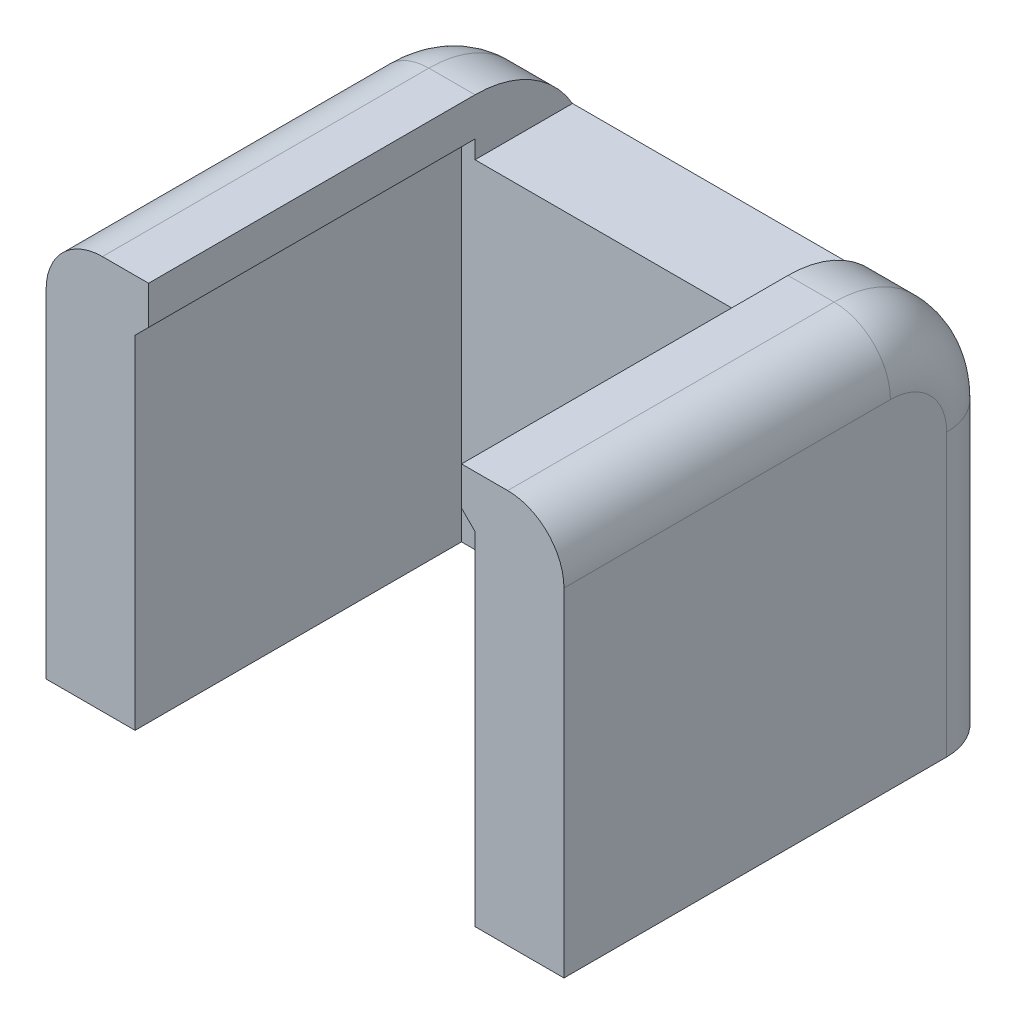
ISO-10303-21;
HEADER;
FILE_DESCRIPTION(('STEP AP214'),'2;1');
FILE_NAME('part.step','',(''),(''),'','','');
FILE_SCHEMA(('AUTOMOTIVE_DESIGN { 1 0 10303 214 1 1 1 1 }'));
ENDSEC;
DATA;
#1=APPLICATION_CONTEXT('core data for automotive mechanical design processes');
#2=APPLICATION_PROTOCOL_DEFINITION('international standard','automotive_design',2000,#1);
#3=PRODUCT_CONTEXT('',#1,'mechanical');
#4=PRODUCT('Part','Part','',(#3));
#5=PRODUCT_RELATED_PRODUCT_CATEGORY('part','',(#4));
#6=PRODUCT_DEFINITION_FORMATION('','',#4);
#7=PRODUCT_DEFINITION_CONTEXT('part definition',#1,'design');
#8=PRODUCT_DEFINITION('design','',#6,#7);
#9=PRODUCT_DEFINITION_SHAPE('','',#8);
#10=(LENGTH_UNIT() NAMED_UNIT(*) SI_UNIT(.MILLI.,.METRE.));
#11=(NAMED_UNIT(*) PLANE_ANGLE_UNIT() SI_UNIT($,.RADIAN.));
#12=(NAMED_UNIT(*) SI_UNIT($,.STERADIAN.) SOLID_ANGLE_UNIT());
#13=UNCERTAINTY_MEASURE_WITH_UNIT(LENGTH_MEASURE(1.E-05),#10,'distance_accuracy_value','');
#14=(GEOMETRIC_REPRESENTATION_CONTEXT(3) GLOBAL_UNCERTAINTY_ASSIGNED_CONTEXT((#13)) GLOBAL_UNIT_ASSIGNED_CONTEXT((#10,
#11,#12)) REPRESENTATION_CONTEXT('',''));
#15=CARTESIAN_POINT('',(0.,0.,0.));
#16=DIRECTION('',(0.,0.,1.));
#17=DIRECTION('',(1.,0.,0.));
#18=AXIS2_PLACEMENT_3D('',#15,#16,#17);
#19=CARTESIAN_POINT('',(23.,17.5,39.));
#20=DIRECTION('',(0.,-1.,0.));
#21=DIRECTION('',(1.,0.,0.));
#22=AXIS2_PLACEMENT_3D('',#19,#20,#21);
#23=PLANE('',#22);
#24=DIRECTION('',(-1.,0.,0.));
#25=VECTOR('',#24,1.);
#26=CARTESIAN_POINT('',(23.,17.5,39.));
#27=LINE('',#26,#25);
#28=CARTESIAN_POINT('',(18.,17.5,39.));
#29=VERTEX_POINT('',#28);
#30=CARTESIAN_POINT('',(13.9,17.5,39.));
#31=VERTEX_POINT('',#30);
#32=EDGE_CURVE('E172',#29,#31,#27,.T.);
#33=ORIENTED_EDGE('',*,*,#32,.F.);
#34=DIRECTION('',(0.,0.,-1.));
#35=VECTOR('',#34,1.);
#36=CARTESIAN_POINT('',(18.,17.5,39.));
#37=LINE('',#36,#35);
#38=CARTESIAN_POINT('',(18.,17.5,10.));
#39=VERTEX_POINT('',#38);
#40=EDGE_CURVE('E49',#29,#39,#37,.T.);
#41=ORIENTED_EDGE('',*,*,#40,.T.);
#42=DIRECTION('',(-1.,0.,0.));
#43=VECTOR('',#42,1.);
#44=CARTESIAN_POINT('',(23.,17.5,10.));
#45=LINE('',#44,#43);
#46=CARTESIAN_POINT('',(13.9,17.5,10.));
#47=VERTEX_POINT('',#46);
#48=EDGE_CURVE('E186',#39,#47,#45,.T.);
#49=ORIENTED_EDGE('',*,*,#48,.T.);
#50=DIRECTION('',(0.,0.,1.));
#51=VECTOR('',#50,1.);
#52=CARTESIAN_POINT('',(13.9,17.5,39.));
#53=LINE('',#52,#51);
#54=EDGE_CURVE('E184',#47,#31,#53,.T.);
#55=ORIENTED_EDGE('',*,*,#54,.T.);
#56=EDGE_LOOP('',(#33,#41,#49,#55));
#57=FACE_BOUND('',#56,.T.);
#58=ADVANCED_FACE('F40',(#57),#23,.F.);
#59=CARTESIAN_POINT('',(0.,0.,39.));
#60=DIRECTION('',(0.,0.,1.));
#61=DIRECTION('',(1.,0.,0.));
#62=AXIS2_PLACEMENT_3D('',#59,#60,#61);
#63=PLANE('',#62);
#64=DIRECTION('',(0.,1.,0.));
#65=VECTOR('',#64,1.);
#66=CARTESIAN_POINT('',(23.,-17.5,39.));
#67=LINE('',#66,#65);
#68=CARTESIAN_POINT('',(23.,-17.5,39.));
#69=VERTEX_POINT('',#68);
#70=CARTESIAN_POINT('',(23.,12.5,39.));
#71=VERTEX_POINT('',#70);
#72=EDGE_CURVE('E239',#69,#71,#67,.T.);
#73=ORIENTED_EDGE('',*,*,#72,.T.);
#74=CARTESIAN_POINT('',(18.,12.5,39.));
#75=DIRECTION('',(0.,0.,1.));
#76=DIRECTION('',(1.,0.,0.));
#77=AXIS2_PLACEMENT_3D('',#74,#75,#76);
#78=CIRCLE('',#77,5.);
#79=EDGE_CURVE('E12',#71,#29,#78,.T.);
#80=ORIENTED_EDGE('',*,*,#79,.T.);
#81=ORIENTED_EDGE('',*,*,#32,.T.);
#82=DIRECTION('',(0.,1.,0.));
#83=VECTOR('',#82,1.);
#84=CARTESIAN_POINT('',(13.9,22.5,39.));
#85=LINE('',#84,#83);
#86=CARTESIAN_POINT('',(13.9,14.1,39.));
#87=VERTEX_POINT('',#86);
#88=EDGE_CURVE('E177',#87,#31,#85,.T.);
#89=ORIENTED_EDGE('',*,*,#88,.F.);
#90=DIRECTION('',(-0.707106781186544,0.707106781186551,0.));
#91=VECTOR('',#90,1.);
#92=CARTESIAN_POINT('',(14.0000000000001,13.9999999999999,39.));
#93=LINE('',#92,#91);
#94=CARTESIAN_POINT('',(15.1,12.9,39.));
#95=VERTEX_POINT('',#94);
#96=EDGE_CURVE('E251',#87,#95,#93,.F.);
#97=ORIENTED_EDGE('',*,*,#96,.T.);
#98=DIRECTION('',(0.,1.,0.));
#99=VECTOR('',#98,1.);
#100=CARTESIAN_POINT('',(15.1,12.5,39.));
#101=LINE('',#100,#99);
#102=CARTESIAN_POINT('',(15.1,-17.5,39.));
#103=VERTEX_POINT('',#102);
#104=EDGE_CURVE('E189',#103,#95,#101,.T.);
#105=ORIENTED_EDGE('',*,*,#104,.F.);
#106=DIRECTION('',(1.,0.,0.));
#107=VECTOR('',#106,1.);
#108=CARTESIAN_POINT('',(23.,-17.5,39.));
#109=LINE('',#108,#107);
#110=EDGE_CURVE('E235',#103,#69,#109,.T.);
#111=ORIENTED_EDGE('',*,*,#110,.T.);
#112=EDGE_LOOP('',(#73,#80,#81,#89,#97,#105,#111));
#113=FACE_BOUND('',#112,.T.);
#114=ADVANCED_FACE('F174',(#113),#63,.T.);
#115=CARTESIAN_POINT('',(-23.,-17.5,39.));
#116=DIRECTION('',(1.,0.,0.));
#117=DIRECTION('',(0.,1.,0.));
#118=AXIS2_PLACEMENT_3D('',#115,#116,#117);
#119=PLANE('',#118);
#120=CARTESIAN_POINT('',(-23.,7.49999999999999,10.));
#121=DIRECTION('',(1.,0.,0.));
#122=DIRECTION('',(0.,1.,0.));
#123=AXIS2_PLACEMENT_3D('',#120,#121,#122);
#124=CIRCLE('',#123,5.);
#125=CARTESIAN_POINT('',(-23.,12.5,10.));
#126=VERTEX_POINT('',#125);
#127=CARTESIAN_POINT('',(-23.,7.49999999999999,5.));
#128=VERTEX_POINT('',#127);
#129=EDGE_CURVE('E286',#126,#128,#124,.F.);
#130=ORIENTED_EDGE('',*,*,#129,.T.);
#131=DIRECTION('',(0.,-1.,0.));
#132=VECTOR('',#131,1.);
#133=CARTESIAN_POINT('',(-23.,-17.5,5.));
#134=LINE('',#133,#132);
#135=CARTESIAN_POINT('',(-23.,-17.5,5.));
#136=VERTEX_POINT('',#135);
#137=EDGE_CURVE('E288',#128,#136,#134,.T.);
#138=ORIENTED_EDGE('',*,*,#137,.T.);
#139=DIRECTION('',(0.,0.,-1.));
#140=VECTOR('',#139,1.);
#141=CARTESIAN_POINT('',(-23.,-17.5,39.));
#142=LINE('',#141,#140);
#143=CARTESIAN_POINT('',(-23.,-17.5,39.));
#144=VERTEX_POINT('',#143);
#145=EDGE_CURVE('E245',#144,#136,#142,.T.);
#146=ORIENTED_EDGE('',*,*,#145,.F.);
#147=DIRECTION('',(0.,-1.,0.));
#148=VECTOR('',#147,1.);
#149=CARTESIAN_POINT('',(-23.,-17.5,39.));
#150=LINE('',#149,#148);
#151=CARTESIAN_POINT('',(-23.,12.5,39.));
#152=VERTEX_POINT('',#151);
#153=EDGE_CURVE('E233',#152,#144,#150,.T.);
#154=ORIENTED_EDGE('',*,*,#153,.F.);
#155=DIRECTION('',(0.,0.,-1.));
#156=VECTOR('',#155,1.);
#157=CARTESIAN_POINT('',(-23.,12.5,39.));
#158=LINE('',#157,#156);
#159=EDGE_CURVE('E284',#152,#126,#158,.T.);
#160=ORIENTED_EDGE('',*,*,#159,.T.);
#161=EDGE_LOOP('',(#130,#138,#146,#154,#160));
#162=FACE_BOUND('',#161,.T.);
#163=ADVANCED_FACE('F355',(#162),#119,.F.);
#164=CARTESIAN_POINT('',(23.,-17.5,39.));
#165=DIRECTION('',(0.,1.,0.));
#166=DIRECTION('',(-1.,0.,0.));
#167=AXIS2_PLACEMENT_3D('',#164,#165,#166);
#168=PLANE('',#167);
#169=ORIENTED_EDGE('',*,*,#145,.T.);
#170=CARTESIAN_POINT('',(-18.,-17.5,5.));
#171=DIRECTION('',(0.,1.,0.));
#172=DIRECTION('',(-1.,0.,0.));
#173=AXIS2_PLACEMENT_3D('',#170,#171,#172);
#174=CIRCLE('',#173,5.);
#175=CARTESIAN_POINT('',(-18.,-17.5,0.));
#176=VERTEX_POINT('',#175);
#177=EDGE_CURVE('E293',#136,#176,#174,.F.);
#178=ORIENTED_EDGE('',*,*,#177,.T.);
#179=DIRECTION('',(1.,0.,0.));
#180=VECTOR('',#179,1.);
#181=CARTESIAN_POINT('',(23.,-17.5,0.));
#182=LINE('',#181,#180);
#183=CARTESIAN_POINT('',(18.,-17.5,0.));
#184=VERTEX_POINT('',#183);
#185=EDGE_CURVE('E232',#176,#184,#182,.T.);
#186=ORIENTED_EDGE('',*,*,#185,.T.);
#187=CARTESIAN_POINT('',(18.,-17.5,5.));
#188=DIRECTION('',(0.,1.,0.));
#189=DIRECTION('',(-1.,0.,0.));
#190=AXIS2_PLACEMENT_3D('',#187,#188,#189);
#191=CIRCLE('',#190,5.);
#192=CARTESIAN_POINT('',(23.,-17.5,5.));
#193=VERTEX_POINT('',#192);
#194=EDGE_CURVE('E291',#184,#193,#191,.F.);
#195=ORIENTED_EDGE('',*,*,#194,.T.);
#196=DIRECTION('',(0.,0.,-1.));
#197=VECTOR('',#196,1.);
#198=CARTESIAN_POINT('',(23.,-17.5,39.));
#199=LINE('',#198,#197);
#200=EDGE_CURVE('E180',#69,#193,#199,.T.);
#201=ORIENTED_EDGE('',*,*,#200,.F.);
#202=ORIENTED_EDGE('',*,*,#110,.F.);
#203=DIRECTION('',(0.,0.,1.));
#204=VECTOR('',#203,1.);
#205=CARTESIAN_POINT('',(15.1,-17.5,-42.5680631459783));
#206=LINE('',#205,#204);
#207=CARTESIAN_POINT('',(15.1,-17.5,10.));
#208=VERTEX_POINT('',#207);
#209=EDGE_CURVE('E217',#208,#103,#206,.T.);
#210=ORIENTED_EDGE('',*,*,#209,.F.);
#211=DIRECTION('',(-1.,0.,0.));
#212=VECTOR('',#211,1.);
#213=CARTESIAN_POINT('',(-15.1,-17.5,10.));
#214=LINE('',#213,#212);
#215=CARTESIAN_POINT('',(-15.1,-17.5,10.));
#216=VERTEX_POINT('',#215);
#217=EDGE_CURVE('E216',#208,#216,#214,.T.);
#218=ORIENTED_EDGE('',*,*,#217,.T.);
#219=DIRECTION('',(0.,0.,1.));
#220=VECTOR('',#219,1.);
#221=CARTESIAN_POINT('',(-15.1,-17.5,-42.5680631459783));
#222=LINE('',#221,#220);
#223=CARTESIAN_POINT('',(-15.1,-17.5,39.));
#224=VERTEX_POINT('',#223);
#225=EDGE_CURVE('E226',#216,#224,#222,.T.);
#226=ORIENTED_EDGE('',*,*,#225,.T.);
#227=EDGE_CURVE('E236',#144,#224,#109,.T.);
#228=ORIENTED_EDGE('',*,*,#227,.F.);
#229=EDGE_LOOP('',(#169,#178,#186,#195,#201,#202,#210,#218,#226,#228));
#230=FACE_BOUND('',#229,.T.);
#231=ADVANCED_FACE('F341',(#230),#168,.F.);
#232=CARTESIAN_POINT('',(23.,-17.5,39.));
#233=DIRECTION('',(-1.,0.,0.));
#234=DIRECTION('',(0.,-1.,0.));
#235=AXIS2_PLACEMENT_3D('',#232,#233,#234);
#236=PLANE('',#235);
#237=ORIENTED_EDGE('',*,*,#200,.T.);
#238=DIRECTION('',(0.,1.,0.));
#239=VECTOR('',#238,1.);
#240=CARTESIAN_POINT('',(23.,-17.5,5.));
#241=LINE('',#240,#239);
#242=CARTESIAN_POINT('',(23.,7.5,5.));
#243=VERTEX_POINT('',#242);
#244=EDGE_CURVE('E307',#193,#243,#241,.T.);
#245=ORIENTED_EDGE('',*,*,#244,.T.);
#246=CARTESIAN_POINT('',(23.,7.5,10.));
#247=DIRECTION('',(-1.,0.,0.));
#248=DIRECTION('',(0.,-1.,0.));
#249=AXIS2_PLACEMENT_3D('',#246,#247,#248);
#250=CIRCLE('',#249,5.);
#251=CARTESIAN_POINT('',(23.,12.5,10.));
#252=VERTEX_POINT('',#251);
#253=EDGE_CURVE('E305',#243,#252,#250,.F.);
#254=ORIENTED_EDGE('',*,*,#253,.T.);
#255=DIRECTION('',(0.,0.,-1.));
#256=VECTOR('',#255,1.);
#257=CARTESIAN_POINT('',(23.,12.5,39.));
#258=LINE('',#257,#256);
#259=EDGE_CURVE('E303',#252,#71,#258,.F.);
#260=ORIENTED_EDGE('',*,*,#259,.T.);
#261=ORIENTED_EDGE('',*,*,#72,.F.);
#262=EDGE_LOOP('',(#237,#245,#254,#260,#261));
#263=FACE_BOUND('',#262,.T.);
#264=ADVANCED_FACE('F335',(#263),#236,.F.);
#265=DIRECTION('',(-1.,0.,0.));
#266=VECTOR('',#265,1.);
#267=CARTESIAN_POINT('',(-18.45,17.5,10.));
#268=LINE('',#267,#266);
#269=CARTESIAN_POINT('',(-13.9,17.5,10.));
#270=VERTEX_POINT('',#269);
#271=CARTESIAN_POINT('',(-18.,17.5,10.));
#272=VERTEX_POINT('',#271);
#273=EDGE_CURVE('E279',#270,#272,#268,.T.);
#274=ORIENTED_EDGE('',*,*,#273,.T.);
#275=DIRECTION('',(0.,0.,-1.));
#276=VECTOR('',#275,1.);
#277=CARTESIAN_POINT('',(-18.,17.5,39.));
#278=LINE('',#277,#276);
#279=CARTESIAN_POINT('',(-18.,17.5,39.));
#280=VERTEX_POINT('',#279);
#281=EDGE_CURVE('E63',#272,#280,#278,.F.);
#282=ORIENTED_EDGE('',*,*,#281,.T.);
#283=CARTESIAN_POINT('',(-13.9,17.5,39.));
#284=VERTEX_POINT('',#283);
#285=EDGE_CURVE('E181',#284,#280,#27,.T.);
#286=ORIENTED_EDGE('',*,*,#285,.F.);
#287=DIRECTION('',(0.,0.,-1.));
#288=VECTOR('',#287,1.);
#289=CARTESIAN_POINT('',(-13.9,17.5,39.));
#290=LINE('',#289,#288);
#291=EDGE_CURVE('E190',#284,#270,#290,.T.);
#292=ORIENTED_EDGE('',*,*,#291,.T.);
#293=EDGE_LOOP('',(#274,#282,#286,#292));
#294=FACE_BOUND('',#293,.T.);
#295=ADVANCED_FACE('F368',(#294),#23,.F.);
#296=ORIENTED_EDGE('',*,*,#285,.T.);
#297=CARTESIAN_POINT('',(-18.,12.5,39.));
#298=DIRECTION('',(0.,0.,1.));
#299=DIRECTION('',(1.,0.,0.));
#300=AXIS2_PLACEMENT_3D('',#297,#298,#299);
#301=CIRCLE('',#300,5.);
#302=EDGE_CURVE('E311',#280,#152,#301,.T.);
#303=ORIENTED_EDGE('',*,*,#302,.T.);
#304=ORIENTED_EDGE('',*,*,#153,.T.);
#305=ORIENTED_EDGE('',*,*,#227,.T.);
#306=DIRECTION('',(0.,-1.,0.));
#307=VECTOR('',#306,1.);
#308=CARTESIAN_POINT('',(-15.1,12.5,39.));
#309=LINE('',#308,#307);
#310=CARTESIAN_POINT('',(-15.1,12.9,39.));
#311=VERTEX_POINT('',#310);
#312=EDGE_CURVE('E224',#311,#224,#309,.T.);
#313=ORIENTED_EDGE('',*,*,#312,.F.);
#314=DIRECTION('',(-0.707106781186551,-0.707106781186544,0.));
#315=VECTOR('',#314,1.);
#316=CARTESIAN_POINT('',(-13.9999999999999,14.0000000000001,39.));
#317=LINE('',#316,#315);
#318=CARTESIAN_POINT('',(-13.9,14.1,39.));
#319=VERTEX_POINT('',#318);
#320=EDGE_CURVE('E253',#311,#319,#317,.F.);
#321=ORIENTED_EDGE('',*,*,#320,.T.);
#322=DIRECTION('',(0.,-1.,0.));
#323=VECTOR('',#322,1.);
#324=CARTESIAN_POINT('',(-13.9,22.5,39.));
#325=LINE('',#324,#323);
#326=EDGE_CURVE('E197',#284,#319,#325,.T.);
#327=ORIENTED_EDGE('',*,*,#326,.F.);
#328=EDGE_LOOP('',(#296,#303,#304,#305,#313,#321,#327));
#329=FACE_BOUND('',#328,.T.);
#330=ADVANCED_FACE('F373',(#329),#63,.T.);
#331=CARTESIAN_POINT('',(0.,0.,0.));
#332=DIRECTION('',(0.,0.,1.));
#333=DIRECTION('',(1.,0.,0.));
#334=AXIS2_PLACEMENT_3D('',#331,#332,#333);
#335=PLANE('',#334);
#336=CARTESIAN_POINT('',(0.,-2.5,0.));
#337=DIRECTION('',(0.,0.,-1.));
#338=DIRECTION('',(-1.,0.,0.));
#339=AXIS2_PLACEMENT_3D('',#336,#337,#338);
#340=CIRCLE('',#339,5.5);
#341=CARTESIAN_POINT('',(-5.5,-2.5,0.));
#342=VERTEX_POINT('',#341);
#343=EDGE_CURVE('E319',#342,#342,#340,.T.);
#344=ORIENTED_EDGE('',*,*,#343,.F.);
#345=EDGE_LOOP('',(#344));
#346=FACE_BOUND('',#345,.T.);
#347=ORIENTED_EDGE('',*,*,#185,.F.);
#348=DIRECTION('',(0.,-1.,0.));
#349=VECTOR('',#348,1.);
#350=CARTESIAN_POINT('',(-18.,0.,0.));
#351=LINE('',#350,#349);
#352=CARTESIAN_POINT('',(-18.,7.5,0.));
#353=VERTEX_POINT('',#352);
#354=EDGE_CURVE('E297',#176,#353,#351,.F.);
#355=ORIENTED_EDGE('',*,*,#354,.T.);
#356=DIRECTION('',(-1.,0.,0.));
#357=VECTOR('',#356,1.);
#358=CARTESIAN_POINT('',(0.,7.5,0.));
#359=LINE('',#358,#357);
#360=CARTESIAN_POINT('',(18.,7.5,0.));
#361=VERTEX_POINT('',#360);
#362=EDGE_CURVE('E281',#353,#361,#359,.F.);
#363=ORIENTED_EDGE('',*,*,#362,.T.);
#364=DIRECTION('',(0.,1.,0.));
#365=VECTOR('',#364,1.);
#366=CARTESIAN_POINT('',(18.,0.,0.));
#367=LINE('',#366,#365);
#368=EDGE_CURVE('E295',#361,#184,#367,.F.);
#369=ORIENTED_EDGE('',*,*,#368,.T.);
#370=EDGE_LOOP('',(#347,#355,#363,#369));
#371=FACE_BOUND('',#370,.T.);
#372=ADVANCED_FACE('F346',(#346,#371),#335,.F.);
#373=CARTESIAN_POINT('',(15.1,12.5,-42.5680631459783));
#374=DIRECTION('',(1.,0.,0.));
#375=DIRECTION('',(0.,0.,-1.));
#376=AXIS2_PLACEMENT_3D('',#373,#374,#375);
#377=PLANE('',#376);
#378=DIRECTION('',(0.,-1.,0.));
#379=VECTOR('',#378,1.);
#380=CARTESIAN_POINT('',(15.1,12.5,10.));
#381=LINE('',#380,#379);
#382=CARTESIAN_POINT('',(15.1,12.9,10.));
#383=VERTEX_POINT('',#382);
#384=EDGE_CURVE('E220',#383,#208,#381,.T.);
#385=ORIENTED_EDGE('',*,*,#384,.T.);
#386=ORIENTED_EDGE('',*,*,#209,.T.);
#387=ORIENTED_EDGE('',*,*,#104,.T.);
#388=DIRECTION('',(0.,0.,1.));
#389=VECTOR('',#388,1.);
#390=CARTESIAN_POINT('',(15.1,12.9,-42.5680631459783));
#391=LINE('',#390,#389);
#392=EDGE_CURVE('E261',#95,#383,#391,.F.);
#393=ORIENTED_EDGE('',*,*,#392,.T.);
#394=EDGE_LOOP('',(#385,#386,#387,#393));
#395=FACE_BOUND('',#394,.T.);
#396=ADVANCED_FACE('F398',(#395),#377,.F.);
#397=CARTESIAN_POINT('',(-15.1,12.5,-42.5680631459783));
#398=DIRECTION('',(-1.,0.,0.));
#399=DIRECTION('',(0.,0.,1.));
#400=AXIS2_PLACEMENT_3D('',#397,#398,#399);
#401=PLANE('',#400);
#402=DIRECTION('',(0.,1.,0.));
#403=VECTOR('',#402,1.);
#404=CARTESIAN_POINT('',(-15.1,12.5,10.));
#405=LINE('',#404,#403);
#406=CARTESIAN_POINT('',(-15.1,12.9,10.));
#407=VERTEX_POINT('',#406);
#408=EDGE_CURVE('E214',#216,#407,#405,.T.);
#409=ORIENTED_EDGE('',*,*,#408,.T.);
#410=DIRECTION('',(0.,0.,-1.));
#411=VECTOR('',#410,1.);
#412=CARTESIAN_POINT('',(-15.1,12.9,-42.5680631459783));
#413=LINE('',#412,#411);
#414=EDGE_CURVE('E266',#407,#311,#413,.F.);
#415=ORIENTED_EDGE('',*,*,#414,.T.);
#416=ORIENTED_EDGE('',*,*,#312,.T.);
#417=ORIENTED_EDGE('',*,*,#225,.F.);
#418=EDGE_LOOP('',(#409,#415,#416,#417));
#419=FACE_BOUND('',#418,.T.);
#420=ADVANCED_FACE('F401',(#419),#401,.F.);
#421=CARTESIAN_POINT('',(0.,0.,10.));
#422=DIRECTION('',(0.,0.,1.));
#423=DIRECTION('',(1.,0.,0.));
#424=AXIS2_PLACEMENT_3D('',#421,#422,#423);
#425=PLANE('',#424);
#426=CARTESIAN_POINT('',(0.,-2.5,10.));
#427=DIRECTION('',(0.,0.,1.));
#428=DIRECTION('',(1.,0.,0.));
#429=AXIS2_PLACEMENT_3D('',#426,#427,#428);
#430=CIRCLE('',#429,3.25);
#431=CARTESIAN_POINT('',(3.25,-2.5,10.));
#432=VERTEX_POINT('',#431);
#433=EDGE_CURVE('E198',#432,#432,#430,.T.);
#434=ORIENTED_EDGE('',*,*,#433,.F.);
#435=EDGE_LOOP('',(#434));
#436=FACE_BOUND('',#435,.T.);
#437=ORIENTED_EDGE('',*,*,#384,.F.);
#438=DIRECTION('',(0.707106781186544,-0.707106781186551,0.));
#439=VECTOR('',#438,1.);
#440=CARTESIAN_POINT('',(13.9,14.1,10.));
#441=LINE('',#440,#439);
#442=CARTESIAN_POINT('',(13.9,14.1,10.));
#443=VERTEX_POINT('',#442);
#444=EDGE_CURVE('E264',#383,#443,#441,.F.);
#445=ORIENTED_EDGE('',*,*,#444,.T.);
#446=DIRECTION('',(0.,1.,0.));
#447=VECTOR('',#446,1.);
#448=CARTESIAN_POINT('',(13.9,0.,10.));
#449=LINE('',#448,#447);
#450=CARTESIAN_POINT('',(13.9,12.5,10.));
#451=VERTEX_POINT('',#450);
#452=EDGE_CURVE('E247',#451,#443,#449,.T.);
#453=ORIENTED_EDGE('',*,*,#452,.F.);
#454=DIRECTION('',(1.,0.,0.));
#455=VECTOR('',#454,1.);
#456=CARTESIAN_POINT('',(-15.1,12.5,10.));
#457=LINE('',#456,#455);
#458=CARTESIAN_POINT('',(-13.9,12.5,10.));
#459=VERTEX_POINT('',#458);
#460=EDGE_CURVE('E222',#459,#451,#457,.T.);
#461=ORIENTED_EDGE('',*,*,#460,.F.);
#462=DIRECTION('',(0.,-1.,0.));
#463=VECTOR('',#462,1.);
#464=CARTESIAN_POINT('',(-13.9,0.,10.));
#465=LINE('',#464,#463);
#466=CARTESIAN_POINT('',(-13.9,14.1,10.));
#467=VERTEX_POINT('',#466);
#468=EDGE_CURVE('E255',#467,#459,#465,.T.);
#469=ORIENTED_EDGE('',*,*,#468,.F.);
#470=DIRECTION('',(0.707106781186551,0.707106781186544,0.));
#471=VECTOR('',#470,1.);
#472=CARTESIAN_POINT('',(-15.5,12.5,10.));
#473=LINE('',#472,#471);
#474=EDGE_CURVE('E269',#467,#407,#473,.F.);
#475=ORIENTED_EDGE('',*,*,#474,.T.);
#476=ORIENTED_EDGE('',*,*,#408,.F.);
#477=ORIENTED_EDGE('',*,*,#217,.F.);
#478=EDGE_LOOP('',(#437,#445,#453,#461,#469,#475,#476,#477));
#479=FACE_BOUND('',#478,.T.);
#480=ADVANCED_FACE('F386',(#436,#479),#425,.T.);
#481=CARTESIAN_POINT('',(13.9,22.5,0.));
#482=DIRECTION('',(1.,0.,0.));
#483=DIRECTION('',(0.,0.,-1.));
#484=AXIS2_PLACEMENT_3D('',#481,#482,#483);
#485=PLANE('',#484);
#486=ORIENTED_EDGE('',*,*,#54,.F.);
#487=CARTESIAN_POINT('',(13.9,7.5,10.));
#488=DIRECTION('',(1.,0.,0.));
#489=DIRECTION('',(0.,0.,-1.));
#490=AXIS2_PLACEMENT_3D('',#487,#488,#489);
#491=CIRCLE('',#490,10.);
#492=CARTESIAN_POINT('',(13.9,12.5,1.33974596215561));
#493=VERTEX_POINT('',#492);
#494=EDGE_CURVE('E273',#47,#493,#491,.F.);
#495=ORIENTED_EDGE('',*,*,#494,.T.);
#496=DIRECTION('',(0.,0.,1.));
#497=VECTOR('',#496,1.);
#498=CARTESIAN_POINT('',(13.9,12.5,0.));
#499=LINE('',#498,#497);
#500=EDGE_CURVE('E209',#493,#451,#499,.T.);
#501=ORIENTED_EDGE('',*,*,#500,.T.);
#502=ORIENTED_EDGE('',*,*,#452,.T.);
#503=DIRECTION('',(0.,0.,1.));
#504=VECTOR('',#503,1.);
#505=CARTESIAN_POINT('',(13.9,14.1,0.));
#506=LINE('',#505,#504);
#507=EDGE_CURVE('E196',#443,#87,#506,.T.);
#508=ORIENTED_EDGE('',*,*,#507,.T.);
#509=ORIENTED_EDGE('',*,*,#88,.T.);
#510=EDGE_LOOP('',(#486,#495,#501,#502,#508,#509));
#511=FACE_BOUND('',#510,.T.);
#512=ADVANCED_FACE('F193',(#511),#485,.F.);
#513=CARTESIAN_POINT('',(-13.9,22.5,0.));
#514=DIRECTION('',(-1.,0.,0.));
#515=DIRECTION('',(0.,0.,1.));
#516=AXIS2_PLACEMENT_3D('',#513,#514,#515);
#517=PLANE('',#516);
#518=DIRECTION('',(0.,0.,1.));
#519=VECTOR('',#518,1.);
#520=CARTESIAN_POINT('',(-13.9,12.5,0.));
#521=LINE('',#520,#519);
#522=CARTESIAN_POINT('',(-13.9,12.5,1.33974596215561));
#523=VERTEX_POINT('',#522);
#524=EDGE_CURVE('E201',#523,#459,#521,.T.);
#525=ORIENTED_EDGE('',*,*,#524,.F.);
#526=CARTESIAN_POINT('',(-13.9,7.5,10.));
#527=DIRECTION('',(-1.,0.,0.));
#528=DIRECTION('',(0.,0.,1.));
#529=AXIS2_PLACEMENT_3D('',#526,#527,#528);
#530=CIRCLE('',#529,10.);
#531=EDGE_CURVE('E277',#523,#270,#530,.F.);
#532=ORIENTED_EDGE('',*,*,#531,.T.);
#533=ORIENTED_EDGE('',*,*,#291,.F.);
#534=ORIENTED_EDGE('',*,*,#326,.T.);
#535=DIRECTION('',(0.,0.,-1.));
#536=VECTOR('',#535,1.);
#537=CARTESIAN_POINT('',(-13.9,14.1,0.));
#538=LINE('',#537,#536);
#539=EDGE_CURVE('E258',#319,#467,#538,.T.);
#540=ORIENTED_EDGE('',*,*,#539,.T.);
#541=ORIENTED_EDGE('',*,*,#468,.T.);
#542=EDGE_LOOP('',(#525,#532,#533,#534,#540,#541));
#543=FACE_BOUND('',#542,.T.);
#544=ADVANCED_FACE('F379',(#543),#517,.F.);
#545=CARTESIAN_POINT('',(-13.9,12.5,0.));
#546=DIRECTION('',(0.,-1.,0.));
#547=DIRECTION('',(0.,0.,-1.));
#548=AXIS2_PLACEMENT_3D('',#545,#546,#547);
#549=PLANE('',#548);
#550=ORIENTED_EDGE('',*,*,#500,.F.);
#551=DIRECTION('',(-1.,0.,0.));
#552=VECTOR('',#551,1.);
#553=CARTESIAN_POINT('',(13.9,12.5,1.33974596215561));
#554=LINE('',#553,#552);
#555=EDGE_CURVE('E275',#493,#523,#554,.T.);
#556=ORIENTED_EDGE('',*,*,#555,.T.);
#557=ORIENTED_EDGE('',*,*,#524,.T.);
#558=ORIENTED_EDGE('',*,*,#460,.T.);
#559=EDGE_LOOP('',(#550,#556,#557,#558));
#560=FACE_BOUND('',#559,.T.);
#561=ADVANCED_FACE('F391',(#560),#549,.F.);
#562=CARTESIAN_POINT('',(0.,-2.5,0.));
#563=DIRECTION('',(0.,0.,-1.));
#564=DIRECTION('',(-1.,0.,0.));
#565=AXIS2_PLACEMENT_3D('',#562,#563,#564);
#566=CYLINDRICAL_SURFACE('',#565,3.25);
#567=ORIENTED_EDGE('',*,*,#433,.T.);
#568=EDGE_LOOP('',(#567));
#569=FACE_BOUND('',#568,.T.);
#570=CARTESIAN_POINT('',(0.,-2.5,5.));
#571=DIRECTION('',(0.,0.,-1.));
#572=DIRECTION('',(-1.,0.,0.));
#573=AXIS2_PLACEMENT_3D('',#570,#571,#572);
#574=CIRCLE('',#573,3.25);
#575=CARTESIAN_POINT('',(-3.25,-2.5,5.));
#576=VERTEX_POINT('',#575);
#577=EDGE_CURVE('E204',#576,#576,#574,.T.);
#578=ORIENTED_EDGE('',*,*,#577,.T.);
#579=EDGE_LOOP('',(#578));
#580=FACE_BOUND('',#579,.T.);
#581=ADVANCED_FACE('F493',(#569,#580),#566,.F.);
#582=CARTESIAN_POINT('',(3.25,-2.5,5.));
#583=DIRECTION('',(0.,0.,1.));
#584=DIRECTION('',(1.,0.,0.));
#585=AXIS2_PLACEMENT_3D('',#582,#583,#584);
#586=PLANE('',#585);
#587=ORIENTED_EDGE('',*,*,#577,.F.);
#588=EDGE_LOOP('',(#587));
#589=FACE_BOUND('',#588,.T.);
#590=CARTESIAN_POINT('',(0.,-2.5,5.));
#591=DIRECTION('',(0.,0.,-1.));
#592=DIRECTION('',(-1.,0.,0.));
#593=AXIS2_PLACEMENT_3D('',#590,#591,#592);
#594=CIRCLE('',#593,5.5);
#595=CARTESIAN_POINT('',(-5.5,-2.5,5.));
#596=VERTEX_POINT('',#595);
#597=EDGE_CURVE('E621',#596,#596,#594,.T.);
#598=ORIENTED_EDGE('',*,*,#597,.T.);
#599=EDGE_LOOP('',(#598));
#600=FACE_BOUND('',#599,.T.);
#601=ADVANCED_FACE('F484',(#589,#600),#586,.F.);
#602=CARTESIAN_POINT('',(0.,-2.5,0.));
#603=DIRECTION('',(0.,0.,-1.));
#604=DIRECTION('',(-1.,0.,0.));
#605=AXIS2_PLACEMENT_3D('',#602,#603,#604);
#606=CYLINDRICAL_SURFACE('',#605,5.5);
#607=ORIENTED_EDGE('',*,*,#597,.F.);
#608=EDGE_LOOP('',(#607));
#609=FACE_BOUND('',#608,.T.);
#610=ORIENTED_EDGE('',*,*,#343,.T.);
#611=EDGE_LOOP('',(#610));
#612=FACE_BOUND('',#611,.T.);
#613=ADVANCED_FACE('F433',(#609,#612),#606,.F.);
#614=CARTESIAN_POINT('',(13.9,14.1,0.));
#615=DIRECTION('',(0.707106781186551,0.707106781186544,0.));
#616=DIRECTION('',(0.,0.,1.));
#617=AXIS2_PLACEMENT_3D('',#614,#615,#616);
#618=PLANE('',#617);
#619=ORIENTED_EDGE('',*,*,#444,.F.);
#620=ORIENTED_EDGE('',*,*,#392,.F.);
#621=ORIENTED_EDGE('',*,*,#96,.F.);
#622=ORIENTED_EDGE('',*,*,#507,.F.);
#623=EDGE_LOOP('',(#619,#620,#621,#622));
#624=FACE_BOUND('',#623,.T.);
#625=ADVANCED_FACE('F396',(#624),#618,.F.);
#626=CARTESIAN_POINT('',(-15.5,12.5,-42.5680631459783));
#627=DIRECTION('',(-0.707106781186544,0.707106781186551,0.));
#628=DIRECTION('',(0.,0.,1.));
#629=AXIS2_PLACEMENT_3D('',#626,#627,#628);
#630=PLANE('',#629);
#631=ORIENTED_EDGE('',*,*,#474,.F.);
#632=ORIENTED_EDGE('',*,*,#539,.F.);
#633=ORIENTED_EDGE('',*,*,#320,.F.);
#634=ORIENTED_EDGE('',*,*,#414,.F.);
#635=EDGE_LOOP('',(#631,#632,#633,#634));
#636=FACE_BOUND('',#635,.T.);
#637=ADVANCED_FACE('F381',(#636),#630,.F.);
#638=CARTESIAN_POINT('',(23.,7.5,10.));
#639=DIRECTION('',(-1.,0.,0.));
#640=DIRECTION('',(0.,-1.,0.));
#641=AXIS2_PLACEMENT_3D('',#638,#639,#640);
#642=CYLINDRICAL_SURFACE('',#641,10.);
#643=ORIENTED_EDGE('',*,*,#362,.F.);
#644=CARTESIAN_POINT('',(-18.,7.5,10.));
#645=DIRECTION('',(1.,0.,0.));
#646=DIRECTION('',(0.,1.,0.));
#647=AXIS2_PLACEMENT_3D('',#644,#645,#646);
#648=CIRCLE('',#647,10.);
#649=EDGE_CURVE('E301',#353,#272,#648,.T.);
#650=ORIENTED_EDGE('',*,*,#649,.T.);
#651=ORIENTED_EDGE('',*,*,#273,.F.);
#652=ORIENTED_EDGE('',*,*,#531,.F.);
#653=ORIENTED_EDGE('',*,*,#555,.F.);
#654=ORIENTED_EDGE('',*,*,#494,.F.);
#655=ORIENTED_EDGE('',*,*,#48,.F.);
#656=CARTESIAN_POINT('',(18.,7.5,10.));
#657=DIRECTION('',(-1.,0.,0.));
#658=DIRECTION('',(0.,-1.,0.));
#659=AXIS2_PLACEMENT_3D('',#656,#657,#658);
#660=CIRCLE('',#659,10.);
#661=EDGE_CURVE('E299',#39,#361,#660,.T.);
#662=ORIENTED_EDGE('',*,*,#661,.T.);
#663=EDGE_LOOP('',(#643,#650,#651,#652,#653,#654,#655,#662));
#664=FACE_BOUND('',#663,.T.);
#665=ADVANCED_FACE('F366',(#664),#642,.T.);
#666=CARTESIAN_POINT('',(-18.,12.5,39.));
#667=DIRECTION('',(0.,0.,-1.));
#668=DIRECTION('',(-1.,0.,0.));
#669=AXIS2_PLACEMENT_3D('',#666,#667,#668);
#670=CYLINDRICAL_SURFACE('',#669,5.);
#671=ORIENTED_EDGE('',*,*,#302,.F.);
#672=ORIENTED_EDGE('',*,*,#281,.F.);
#673=CARTESIAN_POINT('',(-18.,12.5,10.));
#674=DIRECTION('',(0.,0.,-1.));
#675=DIRECTION('',(-1.,0.,0.));
#676=AXIS2_PLACEMENT_3D('',#673,#674,#675);
#677=CIRCLE('',#676,5.);
#678=EDGE_CURVE('E317',#126,#272,#677,.T.);
#679=ORIENTED_EDGE('',*,*,#678,.F.);
#680=ORIENTED_EDGE('',*,*,#159,.F.);
#681=EDGE_LOOP('',(#671,#672,#679,#680));
#682=FACE_BOUND('',#681,.T.);
#683=ADVANCED_FACE('F371',(#682),#670,.T.);
#684=CARTESIAN_POINT('',(-18.,7.5,10.));
#685=DIRECTION('',(1.,0.,0.));
#686=DIRECTION('',(0.,1.,0.));
#687=AXIS2_PLACEMENT_3D('',#684,#685,#686);
#688=DEGENERATE_TOROIDAL_SURFACE('',#687,5.,5.,.T.);
#689=ORIENTED_EDGE('',*,*,#678,.T.);
#690=ORIENTED_EDGE('',*,*,#649,.F.);
#691=CARTESIAN_POINT('',(-18.,7.5,5.));
#692=DIRECTION('',(0.,-1.,0.));
#693=DIRECTION('',(1.,0.,0.));
#694=AXIS2_PLACEMENT_3D('',#691,#692,#693);
#695=CIRCLE('',#694,5.);
#696=EDGE_CURVE('E314',#128,#353,#695,.T.);
#697=ORIENTED_EDGE('',*,*,#696,.F.);
#698=ORIENTED_EDGE('',*,*,#129,.F.);
#699=EDGE_LOOP('',(#689,#690,#697,#698));
#700=FACE_BOUND('',#699,.T.);
#701=ADVANCED_FACE('F363',(#700),#688,.T.);
#702=CARTESIAN_POINT('',(-18.,-17.5,5.));
#703=DIRECTION('',(0.,-1.,0.));
#704=DIRECTION('',(1.,0.,0.));
#705=AXIS2_PLACEMENT_3D('',#702,#703,#704);
#706=CYLINDRICAL_SURFACE('',#705,5.);
#707=ORIENTED_EDGE('',*,*,#696,.T.);
#708=ORIENTED_EDGE('',*,*,#354,.F.);
#709=ORIENTED_EDGE('',*,*,#177,.F.);
#710=ORIENTED_EDGE('',*,*,#137,.F.);
#711=EDGE_LOOP('',(#707,#708,#709,#710));
#712=FACE_BOUND('',#711,.T.);
#713=ADVANCED_FACE('F353',(#712),#706,.T.);
#714=CARTESIAN_POINT('',(18.,12.5,39.));
#715=DIRECTION('',(0.,0.,-1.));
#716=DIRECTION('',(-1.,0.,0.));
#717=AXIS2_PLACEMENT_3D('',#714,#715,#716);
#718=CYLINDRICAL_SURFACE('',#717,5.);
#719=ORIENTED_EDGE('',*,*,#79,.F.);
#720=ORIENTED_EDGE('',*,*,#259,.F.);
#721=CARTESIAN_POINT('',(18.,12.5,10.));
#722=DIRECTION('',(0.,0.,-1.));
#723=DIRECTION('',(-1.,0.,0.));
#724=AXIS2_PLACEMENT_3D('',#721,#722,#723);
#725=CIRCLE('',#724,5.);
#726=EDGE_CURVE('E44',#39,#252,#725,.T.);
#727=ORIENTED_EDGE('',*,*,#726,.F.);
#728=ORIENTED_EDGE('',*,*,#40,.F.);
#729=EDGE_LOOP('',(#719,#720,#727,#728));
#730=FACE_BOUND('',#729,.T.);
#731=ADVANCED_FACE('F42',(#730),#718,.T.);
#732=CARTESIAN_POINT('',(18.,7.5,10.));
#733=DIRECTION('',(-1.,0.,0.));
#734=DIRECTION('',(0.,-1.,0.));
#735=AXIS2_PLACEMENT_3D('',#732,#733,#734);
#736=DEGENERATE_TOROIDAL_SURFACE('',#735,5.,5.,.T.);
#737=ORIENTED_EDGE('',*,*,#726,.T.);
#738=ORIENTED_EDGE('',*,*,#253,.F.);
#739=CARTESIAN_POINT('',(18.,7.5,5.));
#740=DIRECTION('',(0.,-1.,0.));
#741=DIRECTION('',(1.,0.,0.));
#742=AXIS2_PLACEMENT_3D('',#739,#740,#741);
#743=CIRCLE('',#742,5.);
#744=EDGE_CURVE('E320',#361,#243,#743,.T.);
#745=ORIENTED_EDGE('',*,*,#744,.F.);
#746=ORIENTED_EDGE('',*,*,#661,.F.);
#747=EDGE_LOOP('',(#737,#738,#745,#746));
#748=FACE_BOUND('',#747,.T.);
#749=ADVANCED_FACE('F330',(#748),#736,.T.);
#750=CARTESIAN_POINT('',(18.,-17.5,5.));
#751=DIRECTION('',(0.,1.,0.));
#752=DIRECTION('',(-1.,0.,0.));
#753=AXIS2_PLACEMENT_3D('',#750,#751,#752);
#754=CYLINDRICAL_SURFACE('',#753,5.);
#755=ORIENTED_EDGE('',*,*,#194,.F.);
#756=ORIENTED_EDGE('',*,*,#368,.F.);
#757=ORIENTED_EDGE('',*,*,#744,.T.);
#758=ORIENTED_EDGE('',*,*,#244,.F.);
#759=EDGE_LOOP('',(#755,#756,#757,#758));
#760=FACE_BOUND('',#759,.T.);
#761=ADVANCED_FACE('F343',(#760),#754,.T.);
#762=CLOSED_SHELL('',(#58,#114,#163,#231,#264,#295,#330,#372,#396,#420,#480,#512,#544,#561,#581,
#601,#613,#625,#637,#665,#683,#701,#713,#731,#749,#761));
#763=MANIFOLD_SOLID_BREP('B2',#762);
#764=ADVANCED_BREP_SHAPE_REPRESENTATION('',(#18,#763),#14);
#765=SHAPE_DEFINITION_REPRESENTATION(#9,#764);
ENDSEC;
END-ISO-10303-21;
